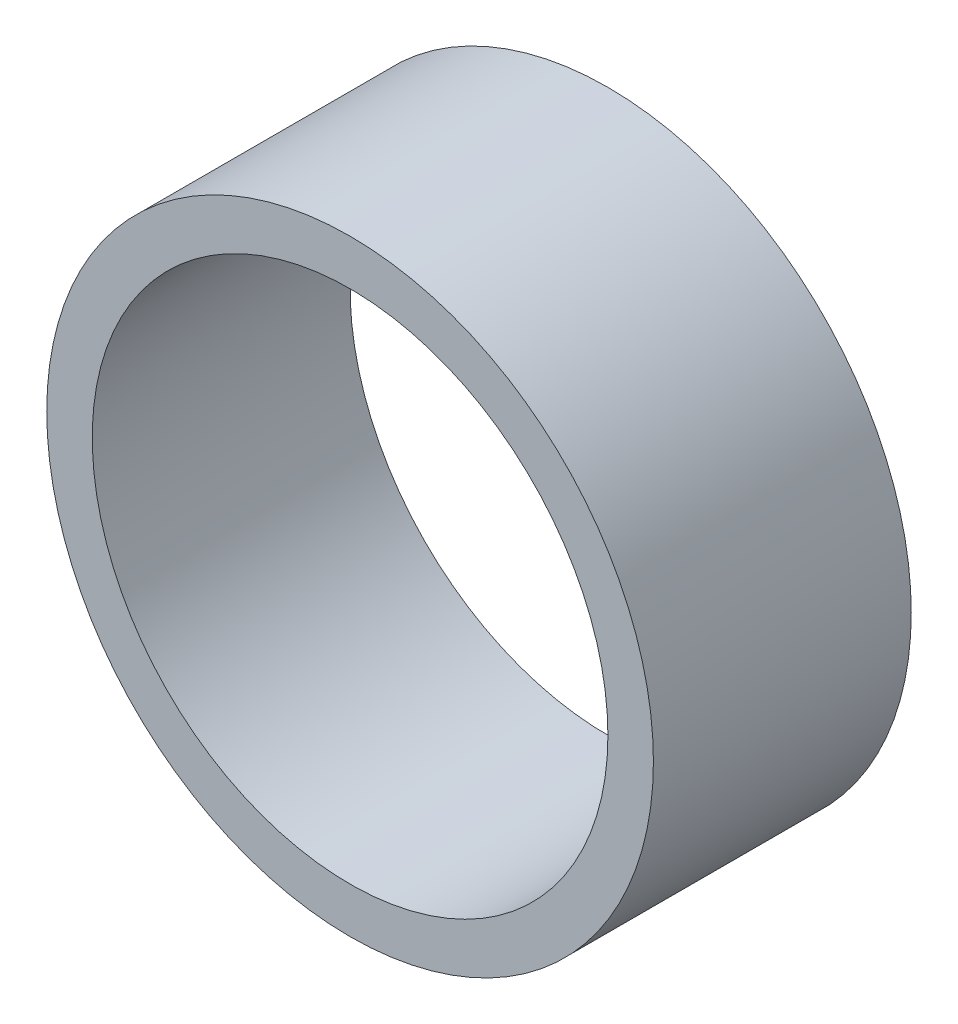
ISO-10303-21;
HEADER;
FILE_DESCRIPTION(('STEP AP214'),'2;1');
FILE_NAME('part.step','',(''),(''),'','','');
FILE_SCHEMA(('AUTOMOTIVE_DESIGN { 1 0 10303 214 1 1 1 1 }'));
ENDSEC;
DATA;
#1=APPLICATION_CONTEXT('core data for automotive mechanical design processes');
#2=APPLICATION_PROTOCOL_DEFINITION('international standard','automotive_design',2000,#1);
#3=PRODUCT_CONTEXT('',#1,'mechanical');
#4=PRODUCT('Part','Part','',(#3));
#5=PRODUCT_RELATED_PRODUCT_CATEGORY('part','',(#4));
#6=PRODUCT_DEFINITION_FORMATION('','',#4);
#7=PRODUCT_DEFINITION_CONTEXT('part definition',#1,'design');
#8=PRODUCT_DEFINITION('design','',#6,#7);
#9=PRODUCT_DEFINITION_SHAPE('','',#8);
#10=(LENGTH_UNIT() NAMED_UNIT(*) SI_UNIT(.MILLI.,.METRE.));
#11=(NAMED_UNIT(*) PLANE_ANGLE_UNIT() SI_UNIT($,.RADIAN.));
#12=(NAMED_UNIT(*) SI_UNIT($,.STERADIAN.) SOLID_ANGLE_UNIT());
#13=UNCERTAINTY_MEASURE_WITH_UNIT(LENGTH_MEASURE(1.E-05),#10,'distance_accuracy_value','');
#14=(GEOMETRIC_REPRESENTATION_CONTEXT(3) GLOBAL_UNCERTAINTY_ASSIGNED_CONTEXT((#13)) GLOBAL_UNIT_ASSIGNED_CONTEXT((#10,
#11,#12)) REPRESENTATION_CONTEXT('',''));
#15=CARTESIAN_POINT('',(0.,0.,0.));
#16=DIRECTION('',(0.,0.,1.));
#17=DIRECTION('',(1.,0.,0.));
#18=AXIS2_PLACEMENT_3D('',#15,#16,#17);
#19=CARTESIAN_POINT('',(0.,0.,42.5));
#20=DIRECTION('',(0.,0.,1.));
#21=DIRECTION('',(1.,0.,0.));
#22=AXIS2_PLACEMENT_3D('',#19,#20,#21);
#23=PLANE('',#22);
#24=CARTESIAN_POINT('',(0.,0.,42.5));
#25=DIRECTION('',(0.,0.,1.));
#26=DIRECTION('',(1.,0.,0.));
#27=AXIS2_PLACEMENT_3D('',#24,#25,#26);
#28=CIRCLE('',#27,50.);
#29=CARTESIAN_POINT('',(50.,0.,42.5));
#30=VERTEX_POINT('',#29);
#31=EDGE_CURVE('E10',#30,#30,#28,.T.);
#32=ORIENTED_EDGE('',*,*,#31,.T.);
#33=EDGE_LOOP('',(#32));
#34=FACE_BOUND('',#33,.T.);
#35=CARTESIAN_POINT('',(0.,0.,42.5));
#36=DIRECTION('',(0.,0.,1.));
#37=DIRECTION('',(1.,0.,0.));
#38=AXIS2_PLACEMENT_3D('',#35,#36,#37);
#39=CIRCLE('',#38,42.5);
#40=CARTESIAN_POINT('',(42.5,0.,42.5));
#41=VERTEX_POINT('',#40);
#42=EDGE_CURVE('E42',#41,#41,#39,.T.);
#43=ORIENTED_EDGE('',*,*,#42,.F.);
#44=EDGE_LOOP('',(#43));
#45=FACE_BOUND('',#44,.T.);
#46=ADVANCED_FACE('F31',(#34,#45),#23,.T.);
#47=CARTESIAN_POINT('',(0.,0.,0.));
#48=DIRECTION('',(0.,0.,1.));
#49=DIRECTION('',(1.,0.,0.));
#50=AXIS2_PLACEMENT_3D('',#47,#48,#49);
#51=PLANE('',#50);
#52=CARTESIAN_POINT('',(0.,0.,0.));
#53=DIRECTION('',(0.,0.,1.));
#54=DIRECTION('',(1.,0.,0.));
#55=AXIS2_PLACEMENT_3D('',#52,#53,#54);
#56=CIRCLE('',#55,50.);
#57=CARTESIAN_POINT('',(50.,0.,0.));
#58=VERTEX_POINT('',#57);
#59=EDGE_CURVE('E35',#58,#58,#56,.T.);
#60=ORIENTED_EDGE('',*,*,#59,.F.);
#61=EDGE_LOOP('',(#60));
#62=FACE_BOUND('',#61,.T.);
#63=CARTESIAN_POINT('',(0.,0.,0.));
#64=DIRECTION('',(0.,0.,1.));
#65=DIRECTION('',(1.,0.,0.));
#66=AXIS2_PLACEMENT_3D('',#63,#64,#65);
#67=CIRCLE('',#66,42.5);
#68=CARTESIAN_POINT('',(42.5,0.,0.));
#69=VERTEX_POINT('',#68);
#70=EDGE_CURVE('E44',#69,#69,#67,.T.);
#71=ORIENTED_EDGE('',*,*,#70,.T.);
#72=EDGE_LOOP('',(#71));
#73=FACE_BOUND('',#72,.T.);
#74=ADVANCED_FACE('F54',(#62,#73),#51,.F.);
#75=CARTESIAN_POINT('',(0.,0.,42.5));
#76=DIRECTION('',(0.,0.,-1.));
#77=DIRECTION('',(-1.,0.,0.));
#78=AXIS2_PLACEMENT_3D('',#75,#76,#77);
#79=CYLINDRICAL_SURFACE('',#78,50.);
#80=ORIENTED_EDGE('',*,*,#31,.F.);
#81=EDGE_LOOP('',(#80));
#82=FACE_BOUND('',#81,.T.);
#83=ORIENTED_EDGE('',*,*,#59,.T.);
#84=EDGE_LOOP('',(#83));
#85=FACE_BOUND('',#84,.T.);
#86=ADVANCED_FACE('F33',(#82,#85),#79,.T.);
#87=CARTESIAN_POINT('',(0.,0.,42.5));
#88=DIRECTION('',(0.,0.,-1.));
#89=DIRECTION('',(-1.,0.,0.));
#90=AXIS2_PLACEMENT_3D('',#87,#88,#89);
#91=CYLINDRICAL_SURFACE('',#90,42.5);
#92=ORIENTED_EDGE('',*,*,#42,.T.);
#93=EDGE_LOOP('',(#92));
#94=FACE_BOUND('',#93,.T.);
#95=ORIENTED_EDGE('',*,*,#70,.F.);
#96=EDGE_LOOP('',(#95));
#97=FACE_BOUND('',#96,.T.);
#98=ADVANCED_FACE('F50',(#94,#97),#91,.F.);
#99=CLOSED_SHELL('',(#46,#74,#86,#98));
#100=MANIFOLD_SOLID_BREP('B2',#99);
#101=ADVANCED_BREP_SHAPE_REPRESENTATION('',(#18,#100),#14);
#102=SHAPE_DEFINITION_REPRESENTATION(#9,#101);
ENDSEC;
END-ISO-10303-21;
